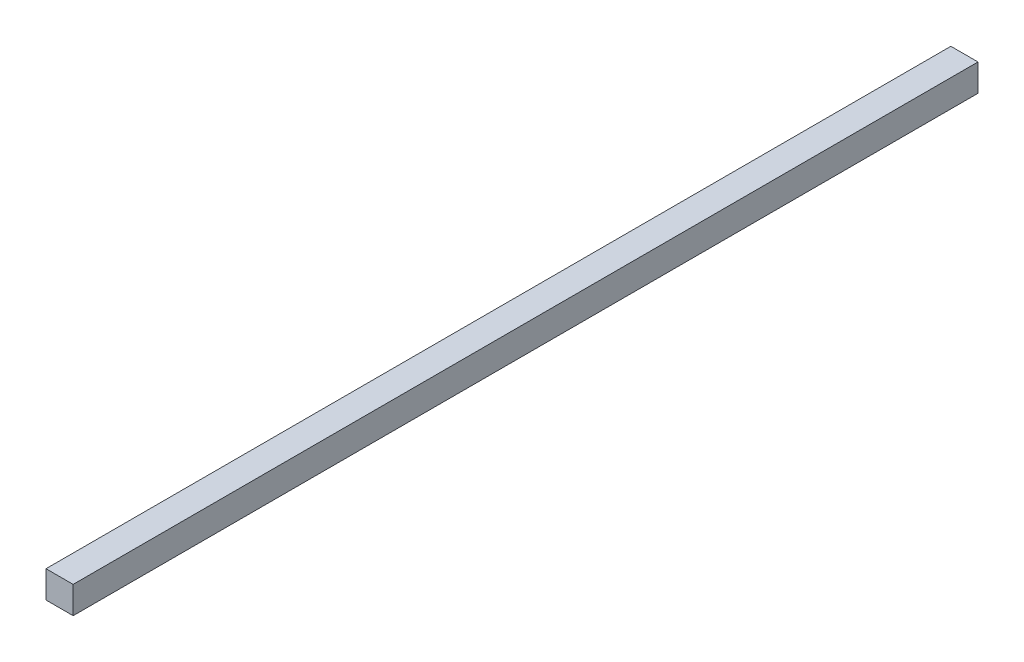
ISO-10303-21;
HEADER;
FILE_DESCRIPTION(('STEP AP214'),'2;1');
FILE_NAME('part.step','',(''),(''),'','','');
FILE_SCHEMA(('AUTOMOTIVE_DESIGN { 1 0 10303 214 1 1 1 1 }'));
ENDSEC;
DATA;
#1=APPLICATION_CONTEXT('core data for automotive mechanical design processes');
#2=APPLICATION_PROTOCOL_DEFINITION('international standard','automotive_design',2000,#1);
#3=PRODUCT_CONTEXT('',#1,'mechanical');
#4=PRODUCT('Part','Part','',(#3));
#5=PRODUCT_RELATED_PRODUCT_CATEGORY('part','',(#4));
#6=PRODUCT_DEFINITION_FORMATION('','',#4);
#7=PRODUCT_DEFINITION_CONTEXT('part definition',#1,'design');
#8=PRODUCT_DEFINITION('design','',#6,#7);
#9=PRODUCT_DEFINITION_SHAPE('','',#8);
#10=(LENGTH_UNIT() NAMED_UNIT(*) SI_UNIT(.MILLI.,.METRE.));
#11=(NAMED_UNIT(*) PLANE_ANGLE_UNIT() SI_UNIT($,.RADIAN.));
#12=(NAMED_UNIT(*) SI_UNIT($,.STERADIAN.) SOLID_ANGLE_UNIT());
#13=UNCERTAINTY_MEASURE_WITH_UNIT(LENGTH_MEASURE(1.E-05),#10,'distance_accuracy_value','');
#14=(GEOMETRIC_REPRESENTATION_CONTEXT(3) GLOBAL_UNCERTAINTY_ASSIGNED_CONTEXT((#13)) GLOBAL_UNIT_ASSIGNED_CONTEXT((#10,
#11,#12)) REPRESENTATION_CONTEXT('',''));
#15=CARTESIAN_POINT('',(0.,0.,0.));
#16=DIRECTION('',(0.,0.,1.));
#17=DIRECTION('',(1.,0.,0.));
#18=AXIS2_PLACEMENT_3D('',#15,#16,#17);
#19=CARTESIAN_POINT('',(15.,15.,1000.));
#20=DIRECTION('',(-1.,0.,0.));
#21=DIRECTION('',(0.,-1.,0.));
#22=AXIS2_PLACEMENT_3D('',#19,#20,#21);
#23=PLANE('',#22);
#24=DIRECTION('',(0.,1.,0.));
#25=VECTOR('',#24,1.);
#26=CARTESIAN_POINT('',(15.,15.,0.));
#27=LINE('',#26,#25);
#28=CARTESIAN_POINT('',(15.,-15.,0.));
#29=VERTEX_POINT('',#28);
#30=CARTESIAN_POINT('',(15.,15.,0.));
#31=VERTEX_POINT('',#30);
#32=EDGE_CURVE('E98',#29,#31,#27,.T.);
#33=ORIENTED_EDGE('',*,*,#32,.T.);
#34=DIRECTION('',(0.,0.,-1.));
#35=VECTOR('',#34,1.);
#36=CARTESIAN_POINT('',(15.,15.,1000.));
#37=LINE('',#36,#35);
#38=CARTESIAN_POINT('',(15.,15.,1000.));
#39=VERTEX_POINT('',#38);
#40=EDGE_CURVE('E11',#39,#31,#37,.T.);
#41=ORIENTED_EDGE('',*,*,#40,.F.);
#42=DIRECTION('',(0.,1.,0.));
#43=VECTOR('',#42,1.);
#44=CARTESIAN_POINT('',(15.,15.,1000.));
#45=LINE('',#44,#43);
#46=CARTESIAN_POINT('',(15.,-15.,1000.));
#47=VERTEX_POINT('',#46);
#48=EDGE_CURVE('E86',#47,#39,#45,.T.);
#49=ORIENTED_EDGE('',*,*,#48,.F.);
#50=DIRECTION('',(0.,0.,-1.));
#51=VECTOR('',#50,1.);
#52=CARTESIAN_POINT('',(15.,-15.,1000.));
#53=LINE('',#52,#51);
#54=EDGE_CURVE('E94',#47,#29,#53,.T.);
#55=ORIENTED_EDGE('',*,*,#54,.T.);
#56=EDGE_LOOP('',(#33,#41,#49,#55));
#57=FACE_BOUND('',#56,.T.);
#58=ADVANCED_FACE('F35',(#57),#23,.F.);
#59=CARTESIAN_POINT('',(-15.,15.,1000.));
#60=DIRECTION('',(0.,-1.,0.));
#61=DIRECTION('',(0.,0.,-1.));
#62=AXIS2_PLACEMENT_3D('',#59,#60,#61);
#63=PLANE('',#62);
#64=DIRECTION('',(-1.,0.,0.));
#65=VECTOR('',#64,1.);
#66=CARTESIAN_POINT('',(-15.,15.,0.));
#67=LINE('',#66,#65);
#68=CARTESIAN_POINT('',(-15.,15.,0.));
#69=VERTEX_POINT('',#68);
#70=EDGE_CURVE('E90',#31,#69,#67,.T.);
#71=ORIENTED_EDGE('',*,*,#70,.T.);
#72=DIRECTION('',(0.,0.,-1.));
#73=VECTOR('',#72,1.);
#74=CARTESIAN_POINT('',(-15.,15.,1000.));
#75=LINE('',#74,#73);
#76=CARTESIAN_POINT('',(-15.,15.,1000.));
#77=VERTEX_POINT('',#76);
#78=EDGE_CURVE('E43',#77,#69,#75,.T.);
#79=ORIENTED_EDGE('',*,*,#78,.F.);
#80=DIRECTION('',(-1.,0.,0.));
#81=VECTOR('',#80,1.);
#82=CARTESIAN_POINT('',(-15.,15.,1000.));
#83=LINE('',#82,#81);
#84=EDGE_CURVE('E81',#39,#77,#83,.T.);
#85=ORIENTED_EDGE('',*,*,#84,.F.);
#86=ORIENTED_EDGE('',*,*,#40,.T.);
#87=EDGE_LOOP('',(#71,#79,#85,#86));
#88=FACE_BOUND('',#87,.T.);
#89=ADVANCED_FACE('F89',(#88),#63,.F.);
#90=CARTESIAN_POINT('',(-15.,15.,1000.));
#91=DIRECTION('',(1.,0.,0.));
#92=DIRECTION('',(0.,1.,0.));
#93=AXIS2_PLACEMENT_3D('',#90,#91,#92);
#94=PLANE('',#93);
#95=DIRECTION('',(0.,-1.,0.));
#96=VECTOR('',#95,1.);
#97=CARTESIAN_POINT('',(-15.,15.,0.));
#98=LINE('',#97,#96);
#99=CARTESIAN_POINT('',(-15.,-15.,0.));
#100=VERTEX_POINT('',#99);
#101=EDGE_CURVE('E68',#69,#100,#98,.T.);
#102=ORIENTED_EDGE('',*,*,#101,.T.);
#103=DIRECTION('',(0.,0.,-1.));
#104=VECTOR('',#103,1.);
#105=CARTESIAN_POINT('',(-15.,-15.,1000.));
#106=LINE('',#105,#104);
#107=CARTESIAN_POINT('',(-15.,-15.,1000.));
#108=VERTEX_POINT('',#107);
#109=EDGE_CURVE('E91',#108,#100,#106,.T.);
#110=ORIENTED_EDGE('',*,*,#109,.F.);
#111=DIRECTION('',(0.,-1.,0.));
#112=VECTOR('',#111,1.);
#113=CARTESIAN_POINT('',(-15.,15.,1000.));
#114=LINE('',#113,#112);
#115=EDGE_CURVE('E84',#77,#108,#114,.T.);
#116=ORIENTED_EDGE('',*,*,#115,.F.);
#117=ORIENTED_EDGE('',*,*,#78,.T.);
#118=EDGE_LOOP('',(#102,#110,#116,#117));
#119=FACE_BOUND('',#118,.T.);
#120=ADVANCED_FACE('F92',(#119),#94,.F.);
#121=CARTESIAN_POINT('',(-15.,-15.,1000.));
#122=DIRECTION('',(0.,1.,0.));
#123=DIRECTION('',(0.,0.,1.));
#124=AXIS2_PLACEMENT_3D('',#121,#122,#123);
#125=PLANE('',#124);
#126=DIRECTION('',(1.,0.,0.));
#127=VECTOR('',#126,1.);
#128=CARTESIAN_POINT('',(-15.,-15.,0.));
#129=LINE('',#128,#127);
#130=EDGE_CURVE('E74',#100,#29,#129,.T.);
#131=ORIENTED_EDGE('',*,*,#130,.T.);
#132=ORIENTED_EDGE('',*,*,#54,.F.);
#133=DIRECTION('',(1.,0.,0.));
#134=VECTOR('',#133,1.);
#135=CARTESIAN_POINT('',(-15.,-15.,1000.));
#136=LINE('',#135,#134);
#137=EDGE_CURVE('E51',#108,#47,#136,.T.);
#138=ORIENTED_EDGE('',*,*,#137,.F.);
#139=ORIENTED_EDGE('',*,*,#109,.T.);
#140=EDGE_LOOP('',(#131,#132,#138,#139));
#141=FACE_BOUND('',#140,.T.);
#142=ADVANCED_FACE('F105',(#141),#125,.F.);
#143=CARTESIAN_POINT('',(0.,0.,1000.));
#144=DIRECTION('',(0.,0.,1.));
#145=DIRECTION('',(1.,0.,0.));
#146=AXIS2_PLACEMENT_3D('',#143,#144,#145);
#147=PLANE('',#146);
#148=ORIENTED_EDGE('',*,*,#48,.T.);
#149=ORIENTED_EDGE('',*,*,#84,.T.);
#150=ORIENTED_EDGE('',*,*,#115,.T.);
#151=ORIENTED_EDGE('',*,*,#137,.T.);
#152=EDGE_LOOP('',(#148,#149,#150,#151));
#153=FACE_BOUND('',#152,.T.);
#154=ADVANCED_FACE('F82',(#153),#147,.T.);
#155=CARTESIAN_POINT('',(0.,0.,0.));
#156=DIRECTION('',(0.,0.,1.));
#157=DIRECTION('',(1.,0.,0.));
#158=AXIS2_PLACEMENT_3D('',#155,#156,#157);
#159=PLANE('',#158);
#160=ORIENTED_EDGE('',*,*,#32,.F.);
#161=ORIENTED_EDGE('',*,*,#130,.F.);
#162=ORIENTED_EDGE('',*,*,#101,.F.);
#163=ORIENTED_EDGE('',*,*,#70,.F.);
#164=EDGE_LOOP('',(#160,#161,#162,#163));
#165=FACE_BOUND('',#164,.T.);
#166=ADVANCED_FACE('F108',(#165),#159,.F.);
#167=CLOSED_SHELL('',(#58,#89,#120,#142,#154,#166));
#168=MANIFOLD_SOLID_BREP('B2',#167);
#169=ADVANCED_BREP_SHAPE_REPRESENTATION('',(#18,#168),#14);
#170=SHAPE_DEFINITION_REPRESENTATION(#9,#169);
ENDSEC;
END-ISO-10303-21;
